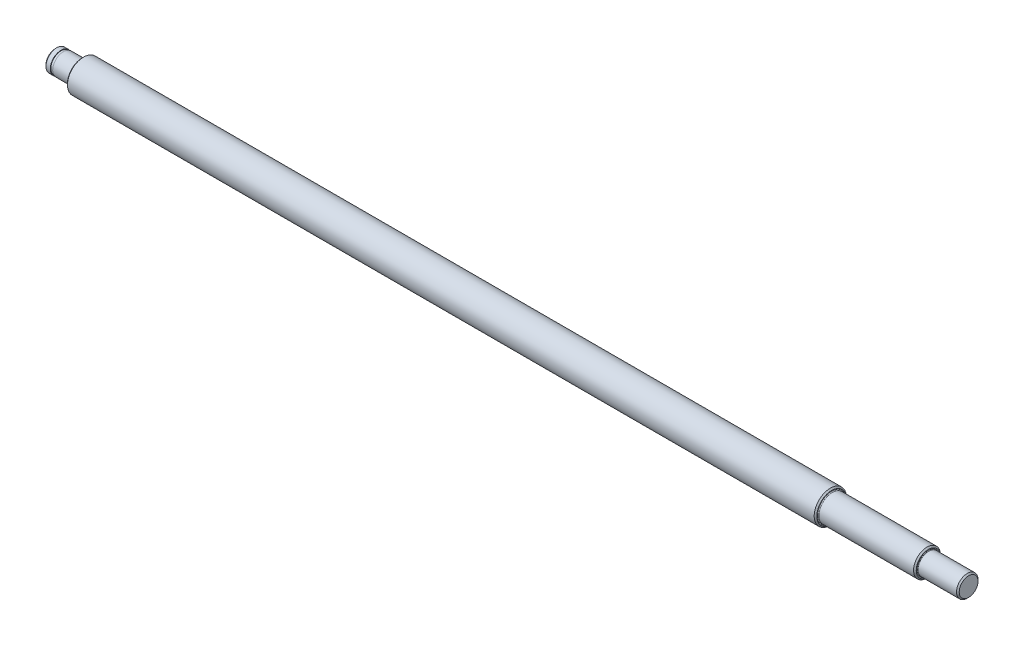
ISO-10303-21;
HEADER;
FILE_DESCRIPTION(('STEP AP214'),'2;1');
FILE_NAME('part.step','',(''),(''),'','','');
FILE_SCHEMA(('AUTOMOTIVE_DESIGN { 1 0 10303 214 1 1 1 1 }'));
ENDSEC;
DATA;
#1=APPLICATION_CONTEXT('core data for automotive mechanical design processes');
#2=APPLICATION_PROTOCOL_DEFINITION('international standard','automotive_design',2000,#1);
#3=PRODUCT_CONTEXT('',#1,'mechanical');
#4=PRODUCT('Part','Part','',(#3));
#5=PRODUCT_RELATED_PRODUCT_CATEGORY('part','',(#4));
#6=PRODUCT_DEFINITION_FORMATION('','',#4);
#7=PRODUCT_DEFINITION_CONTEXT('part definition',#1,'design');
#8=PRODUCT_DEFINITION('design','',#6,#7);
#9=PRODUCT_DEFINITION_SHAPE('','',#8);
#10=(LENGTH_UNIT() NAMED_UNIT(*) SI_UNIT(.MILLI.,.METRE.));
#11=(NAMED_UNIT(*) PLANE_ANGLE_UNIT() SI_UNIT($,.RADIAN.));
#12=(NAMED_UNIT(*) SI_UNIT($,.STERADIAN.) SOLID_ANGLE_UNIT());
#13=UNCERTAINTY_MEASURE_WITH_UNIT(LENGTH_MEASURE(1.E-05),#10,'distance_accuracy_value','');
#14=(GEOMETRIC_REPRESENTATION_CONTEXT(3) GLOBAL_UNCERTAINTY_ASSIGNED_CONTEXT((#13)) GLOBAL_UNIT_ASSIGNED_CONTEXT((#10,
#11,#12)) REPRESENTATION_CONTEXT('',''));
#15=CARTESIAN_POINT('',(0.,0.,0.));
#16=DIRECTION('',(0.,0.,1.));
#17=DIRECTION('',(1.,0.,0.));
#18=AXIS2_PLACEMENT_3D('',#15,#16,#17);
#19=CARTESIAN_POINT('',(0.500000000000004,0.,0.));
#20=DIRECTION('',(1.,0.,0.));
#21=DIRECTION('',(0.,0.,-1.));
#22=AXIS2_PLACEMENT_3D('',#19,#20,#21);
#23=CONICAL_SURFACE('',#22,4.,0.785398163397416);
#24=CARTESIAN_POINT('',(0.,0.,0.));
#25=DIRECTION('',(-1.,0.,0.));
#26=DIRECTION('',(0.,0.,1.));
#27=AXIS2_PLACEMENT_3D('',#24,#25,#26);
#28=CIRCLE('',#27,3.50000000000003);
#29=CARTESIAN_POINT('',(0.,0.,3.50000000000003));
#30=VERTEX_POINT('',#29);
#31=EDGE_CURVE('E104',#30,#30,#28,.T.);
#32=ORIENTED_EDGE('',*,*,#31,.F.);
#33=EDGE_LOOP('',(#32));
#34=FACE_BOUND('',#33,.T.);
#35=CARTESIAN_POINT('',(0.500000000000004,0.,0.));
#36=DIRECTION('',(-1.,0.,0.));
#37=DIRECTION('',(0.,0.,1.));
#38=AXIS2_PLACEMENT_3D('',#35,#36,#37);
#39=CIRCLE('',#38,4.);
#40=CARTESIAN_POINT('',(0.500000000000004,0.,4.));
#41=VERTEX_POINT('',#40);
#42=EDGE_CURVE('E10',#41,#41,#39,.T.);
#43=ORIENTED_EDGE('',*,*,#42,.T.);
#44=EDGE_LOOP('',(#43));
#45=FACE_BOUND('',#44,.T.);
#46=ADVANCED_FACE('F40',(#34,#45),#23,.T.);
#47=CARTESIAN_POINT('',(-20.,0.,0.));
#48=DIRECTION('',(-1.,0.,0.));
#49=DIRECTION('',(0.,0.,1.));
#50=AXIS2_PLACEMENT_3D('',#47,#48,#49);
#51=CYLINDRICAL_SURFACE('',#50,4.);
#52=ORIENTED_EDGE('',*,*,#42,.F.);
#53=EDGE_LOOP('',(#52));
#54=FACE_BOUND('',#53,.T.);
#55=CARTESIAN_POINT('',(2.10000000000001,0.,0.));
#56=DIRECTION('',(-1.,0.,0.));
#57=DIRECTION('',(0.,0.,1.));
#58=AXIS2_PLACEMENT_3D('',#55,#56,#57);
#59=CIRCLE('',#58,4.);
#60=CARTESIAN_POINT('',(2.10000000000001,0.,4.));
#61=VERTEX_POINT('',#60);
#62=EDGE_CURVE('E46',#61,#61,#59,.T.);
#63=ORIENTED_EDGE('',*,*,#62,.T.);
#64=EDGE_LOOP('',(#63));
#65=FACE_BOUND('',#64,.T.);
#66=ADVANCED_FACE('F111',(#54,#65),#51,.T.);
#67=CARTESIAN_POINT('',(2.10000000000001,4.,0.));
#68=DIRECTION('',(-1.,0.,0.));
#69=DIRECTION('',(0.,0.,1.));
#70=AXIS2_PLACEMENT_3D('',#67,#68,#69);
#71=PLANE('',#70);
#72=ORIENTED_EDGE('',*,*,#62,.F.);
#73=EDGE_LOOP('',(#72));
#74=FACE_BOUND('',#73,.T.);
#75=CARTESIAN_POINT('',(2.10000000000001,0.,0.));
#76=DIRECTION('',(-1.,0.,0.));
#77=DIRECTION('',(0.,0.,1.));
#78=AXIS2_PLACEMENT_3D('',#75,#76,#77);
#79=CIRCLE('',#78,3.8);
#80=CARTESIAN_POINT('',(2.10000000000001,0.,3.8));
#81=VERTEX_POINT('',#80);
#82=EDGE_CURVE('E50',#81,#81,#79,.T.);
#83=ORIENTED_EDGE('',*,*,#82,.T.);
#84=EDGE_LOOP('',(#83));
#85=FACE_BOUND('',#84,.T.);
#86=ADVANCED_FACE('F115',(#74,#85),#71,.F.);
#87=CARTESIAN_POINT('',(-20.,0.,0.));
#88=DIRECTION('',(-1.,0.,0.));
#89=DIRECTION('',(0.,0.,1.));
#90=AXIS2_PLACEMENT_3D('',#87,#88,#89);
#91=CYLINDRICAL_SURFACE('',#90,3.8);
#92=ORIENTED_EDGE('',*,*,#82,.F.);
#93=EDGE_LOOP('',(#92));
#94=FACE_BOUND('',#93,.T.);
#95=CARTESIAN_POINT('',(3.00000000000001,0.,0.));
#96=DIRECTION('',(-1.,0.,0.));
#97=DIRECTION('',(0.,0.,1.));
#98=AXIS2_PLACEMENT_3D('',#95,#96,#97);
#99=CIRCLE('',#98,3.8);
#100=CARTESIAN_POINT('',(3.00000000000001,0.,3.8));
#101=VERTEX_POINT('',#100);
#102=EDGE_CURVE('E54',#101,#101,#99,.T.);
#103=ORIENTED_EDGE('',*,*,#102,.T.);
#104=EDGE_LOOP('',(#103));
#105=FACE_BOUND('',#104,.T.);
#106=ADVANCED_FACE('F120',(#94,#105),#91,.T.);
#107=CARTESIAN_POINT('',(3.00000000000001,4.,0.));
#108=DIRECTION('',(1.,0.,0.));
#109=DIRECTION('',(0.,0.,-1.));
#110=AXIS2_PLACEMENT_3D('',#107,#108,#109);
#111=PLANE('',#110);
#112=ORIENTED_EDGE('',*,*,#102,.F.);
#113=EDGE_LOOP('',(#112));
#114=FACE_BOUND('',#113,.T.);
#115=CARTESIAN_POINT('',(3.00000000000001,0.,0.));
#116=DIRECTION('',(-1.,0.,0.));
#117=DIRECTION('',(0.,0.,1.));
#118=AXIS2_PLACEMENT_3D('',#115,#116,#117);
#119=CIRCLE('',#118,4.);
#120=CARTESIAN_POINT('',(3.00000000000001,0.,4.));
#121=VERTEX_POINT('',#120);
#122=EDGE_CURVE('E59',#121,#121,#119,.T.);
#123=ORIENTED_EDGE('',*,*,#122,.T.);
#124=EDGE_LOOP('',(#123));
#125=FACE_BOUND('',#124,.T.);
#126=ADVANCED_FACE('F126',(#114,#125),#111,.F.);
#127=CARTESIAN_POINT('',(-20.,0.,0.));
#128=DIRECTION('',(-1.,0.,0.));
#129=DIRECTION('',(0.,0.,1.));
#130=AXIS2_PLACEMENT_3D('',#127,#128,#129);
#131=CYLINDRICAL_SURFACE('',#130,4.);
#132=ORIENTED_EDGE('',*,*,#122,.F.);
#133=EDGE_LOOP('',(#132));
#134=FACE_BOUND('',#133,.T.);
#135=CARTESIAN_POINT('',(9.70000000000001,0.,0.));
#136=DIRECTION('',(-1.,0.,0.));
#137=DIRECTION('',(0.,0.,1.));
#138=AXIS2_PLACEMENT_3D('',#135,#136,#137);
#139=CIRCLE('',#138,4.);
#140=CARTESIAN_POINT('',(9.70000000000001,0.,4.));
#141=VERTEX_POINT('',#140);
#142=EDGE_CURVE('E62',#141,#141,#139,.T.);
#143=ORIENTED_EDGE('',*,*,#142,.T.);
#144=EDGE_LOOP('',(#143));
#145=FACE_BOUND('',#144,.T.);
#146=ADVANCED_FACE('F130',(#134,#145),#131,.T.);
#147=CARTESIAN_POINT('',(9.70000000000001,0.,0.));
#148=DIRECTION('',(-1.,0.,0.));
#149=DIRECTION('',(0.,0.,1.));
#150=AXIS2_PLACEMENT_3D('',#147,#148,#149);
#151=TOROIDAL_SURFACE('',#150,4.3,0.3);
#152=ORIENTED_EDGE('',*,*,#142,.F.);
#153=EDGE_LOOP('',(#152));
#154=FACE_BOUND('',#153,.T.);
#155=CARTESIAN_POINT('',(10.,0.,0.));
#156=DIRECTION('',(-1.,0.,0.));
#157=DIRECTION('',(0.,0.,1.));
#158=AXIS2_PLACEMENT_3D('',#155,#156,#157);
#159=CIRCLE('',#158,4.3);
#160=CARTESIAN_POINT('',(10.,0.,4.3));
#161=VERTEX_POINT('',#160);
#162=EDGE_CURVE('E65',#161,#161,#159,.T.);
#163=ORIENTED_EDGE('',*,*,#162,.T.);
#164=EDGE_LOOP('',(#163));
#165=FACE_BOUND('',#164,.T.);
#166=ADVANCED_FACE('F134',(#154,#165),#151,.F.);
#167=CARTESIAN_POINT('',(10.,5.50000000000002,0.));
#168=DIRECTION('',(1.,0.,0.));
#169=DIRECTION('',(0.,0.,-1.));
#170=AXIS2_PLACEMENT_3D('',#167,#168,#169);
#171=PLANE('',#170);
#172=ORIENTED_EDGE('',*,*,#162,.F.);
#173=EDGE_LOOP('',(#172));
#174=FACE_BOUND('',#173,.T.);
#175=CARTESIAN_POINT('',(10.,0.,0.));
#176=DIRECTION('',(-1.,0.,0.));
#177=DIRECTION('',(0.,0.,1.));
#178=AXIS2_PLACEMENT_3D('',#175,#176,#177);
#179=CIRCLE('',#178,5.50000000000002);
#180=CARTESIAN_POINT('',(10.,0.,5.50000000000002));
#181=VERTEX_POINT('',#180);
#182=EDGE_CURVE('E68',#181,#181,#179,.T.);
#183=ORIENTED_EDGE('',*,*,#182,.T.);
#184=EDGE_LOOP('',(#183));
#185=FACE_BOUND('',#184,.T.);
#186=ADVANCED_FACE('F138',(#174,#185),#171,.F.);
#187=CARTESIAN_POINT('',(10.5,0.,0.));
#188=DIRECTION('',(1.,0.,0.));
#189=DIRECTION('',(0.,0.,-1.));
#190=AXIS2_PLACEMENT_3D('',#187,#188,#189);
#191=CONICAL_SURFACE('',#190,5.99999999999999,0.785398163397423);
#192=ORIENTED_EDGE('',*,*,#182,.F.);
#193=EDGE_LOOP('',(#192));
#194=FACE_BOUND('',#193,.T.);
#195=CARTESIAN_POINT('',(10.5,0.,0.));
#196=DIRECTION('',(-1.,0.,0.));
#197=DIRECTION('',(0.,0.,1.));
#198=AXIS2_PLACEMENT_3D('',#195,#196,#197);
#199=CIRCLE('',#198,5.99999999999999);
#200=CARTESIAN_POINT('',(10.5,0.,5.99999999999999));
#201=VERTEX_POINT('',#200);
#202=EDGE_CURVE('E71',#201,#201,#199,.T.);
#203=ORIENTED_EDGE('',*,*,#202,.T.);
#204=EDGE_LOOP('',(#203));
#205=FACE_BOUND('',#204,.T.);
#206=ADVANCED_FACE('F142',(#194,#205),#191,.T.);
#207=CARTESIAN_POINT('',(-20.,0.,0.));
#208=DIRECTION('',(-1.,0.,0.));
#209=DIRECTION('',(0.,0.,1.));
#210=AXIS2_PLACEMENT_3D('',#207,#208,#209);
#211=CYLINDRICAL_SURFACE('',#210,6.00000000000002);
#212=ORIENTED_EDGE('',*,*,#202,.F.);
#213=EDGE_LOOP('',(#212));
#214=FACE_BOUND('',#213,.T.);
#215=CARTESIAN_POINT('',(288.5,0.,0.));
#216=DIRECTION('',(-1.,0.,0.));
#217=DIRECTION('',(0.,0.,1.));
#218=AXIS2_PLACEMENT_3D('',#215,#216,#217);
#219=CIRCLE('',#218,6.00000000000005);
#220=CARTESIAN_POINT('',(288.5,0.,6.00000000000005));
#221=VERTEX_POINT('',#220);
#222=EDGE_CURVE('E74',#221,#221,#219,.T.);
#223=ORIENTED_EDGE('',*,*,#222,.T.);
#224=EDGE_LOOP('',(#223));
#225=FACE_BOUND('',#224,.T.);
#226=ADVANCED_FACE('F146',(#214,#225),#211,.T.);
#227=CARTESIAN_POINT('',(289.,0.,0.));
#228=DIRECTION('',(-1.,0.,0.));
#229=DIRECTION('',(0.,0.,1.));
#230=AXIS2_PLACEMENT_3D('',#227,#228,#229);
#231=CONICAL_SURFACE('',#230,5.50000000000002,0.78539816339748);
#232=ORIENTED_EDGE('',*,*,#222,.F.);
#233=EDGE_LOOP('',(#232));
#234=FACE_BOUND('',#233,.T.);
#235=CARTESIAN_POINT('',(289.,0.,0.));
#236=DIRECTION('',(-1.,0.,0.));
#237=DIRECTION('',(0.,0.,1.));
#238=AXIS2_PLACEMENT_3D('',#235,#236,#237);
#239=CIRCLE('',#238,5.50000000000002);
#240=CARTESIAN_POINT('',(289.,0.,5.50000000000002));
#241=VERTEX_POINT('',#240);
#242=EDGE_CURVE('E77',#241,#241,#239,.T.);
#243=ORIENTED_EDGE('',*,*,#242,.T.);
#244=EDGE_LOOP('',(#243));
#245=FACE_BOUND('',#244,.T.);
#246=ADVANCED_FACE('F150',(#234,#245),#231,.T.);
#247=CARTESIAN_POINT('',(289.,5.30000000000004,0.));
#248=DIRECTION('',(-1.,0.,0.));
#249=DIRECTION('',(0.,0.,1.));
#250=AXIS2_PLACEMENT_3D('',#247,#248,#249);
#251=PLANE('',#250);
#252=ORIENTED_EDGE('',*,*,#242,.F.);
#253=EDGE_LOOP('',(#252));
#254=FACE_BOUND('',#253,.T.);
#255=CARTESIAN_POINT('',(289.,0.,0.));
#256=DIRECTION('',(-1.,0.,0.));
#257=DIRECTION('',(0.,0.,1.));
#258=AXIS2_PLACEMENT_3D('',#255,#256,#257);
#259=CIRCLE('',#258,5.30000000000004);
#260=CARTESIAN_POINT('',(289.,0.,5.30000000000004));
#261=VERTEX_POINT('',#260);
#262=EDGE_CURVE('E80',#261,#261,#259,.T.);
#263=ORIENTED_EDGE('',*,*,#262,.T.);
#264=EDGE_LOOP('',(#263));
#265=FACE_BOUND('',#264,.T.);
#266=ADVANCED_FACE('F154',(#254,#265),#251,.F.);
#267=CARTESIAN_POINT('',(289.3,0.,0.));
#268=DIRECTION('',(-1.,0.,0.));
#269=DIRECTION('',(0.,0.,1.));
#270=AXIS2_PLACEMENT_3D('',#267,#268,#269);
#271=TOROIDAL_SURFACE('',#270,5.30000000000004,0.300000000000011);
#272=ORIENTED_EDGE('',*,*,#262,.F.);
#273=EDGE_LOOP('',(#272));
#274=FACE_BOUND('',#273,.T.);
#275=CARTESIAN_POINT('',(289.3,0.,0.));
#276=DIRECTION('',(-1.,0.,0.));
#277=DIRECTION('',(0.,0.,1.));
#278=AXIS2_PLACEMENT_3D('',#275,#276,#277);
#279=CIRCLE('',#278,5.00000000000004);
#280=CARTESIAN_POINT('',(289.3,0.,5.00000000000004));
#281=VERTEX_POINT('',#280);
#282=EDGE_CURVE('E83',#281,#281,#279,.T.);
#283=ORIENTED_EDGE('',*,*,#282,.T.);
#284=EDGE_LOOP('',(#283));
#285=FACE_BOUND('',#284,.T.);
#286=ADVANCED_FACE('F158',(#274,#285),#271,.F.);
#287=CARTESIAN_POINT('',(-20.,0.,0.));
#288=DIRECTION('',(-1.,0.,0.));
#289=DIRECTION('',(0.,0.,1.));
#290=AXIS2_PLACEMENT_3D('',#287,#288,#289);
#291=CYLINDRICAL_SURFACE('',#290,5.00000000000007);
#292=ORIENTED_EDGE('',*,*,#282,.F.);
#293=EDGE_LOOP('',(#292));
#294=FACE_BOUND('',#293,.T.);
#295=CARTESIAN_POINT('',(324.5,0.,0.));
#296=DIRECTION('',(-1.,0.,0.));
#297=DIRECTION('',(0.,0.,1.));
#298=AXIS2_PLACEMENT_3D('',#295,#296,#297);
#299=CIRCLE('',#298,5.0000000000001);
#300=CARTESIAN_POINT('',(324.5,0.,5.0000000000001));
#301=VERTEX_POINT('',#300);
#302=EDGE_CURVE('E86',#301,#301,#299,.T.);
#303=ORIENTED_EDGE('',*,*,#302,.T.);
#304=EDGE_LOOP('',(#303));
#305=FACE_BOUND('',#304,.T.);
#306=ADVANCED_FACE('F162',(#294,#305),#291,.T.);
#307=CARTESIAN_POINT('',(325.,0.,0.));
#308=DIRECTION('',(-1.,0.,0.));
#309=DIRECTION('',(0.,0.,1.));
#310=AXIS2_PLACEMENT_3D('',#307,#308,#309);
#311=CONICAL_SURFACE('',#310,4.50000000000007,0.785398163397474);
#312=ORIENTED_EDGE('',*,*,#302,.F.);
#313=EDGE_LOOP('',(#312));
#314=FACE_BOUND('',#313,.T.);
#315=CARTESIAN_POINT('',(325.,0.,0.));
#316=DIRECTION('',(-1.,0.,0.));
#317=DIRECTION('',(0.,0.,1.));
#318=AXIS2_PLACEMENT_3D('',#315,#316,#317);
#319=CIRCLE('',#318,4.50000000000007);
#320=CARTESIAN_POINT('',(325.,0.,4.50000000000007));
#321=VERTEX_POINT('',#320);
#322=EDGE_CURVE('E89',#321,#321,#319,.T.);
#323=ORIENTED_EDGE('',*,*,#322,.T.);
#324=EDGE_LOOP('',(#323));
#325=FACE_BOUND('',#324,.T.);
#326=ADVANCED_FACE('F166',(#314,#325),#311,.T.);
#327=CARTESIAN_POINT('',(325.,4.20000000000006,0.));
#328=DIRECTION('',(-1.,0.,0.));
#329=DIRECTION('',(0.,0.,1.));
#330=AXIS2_PLACEMENT_3D('',#327,#328,#329);
#331=PLANE('',#330);
#332=ORIENTED_EDGE('',*,*,#322,.F.);
#333=EDGE_LOOP('',(#332));
#334=FACE_BOUND('',#333,.T.);
#335=CARTESIAN_POINT('',(325.,0.,0.));
#336=DIRECTION('',(-1.,0.,0.));
#337=DIRECTION('',(0.,0.,1.));
#338=AXIS2_PLACEMENT_3D('',#335,#336,#337);
#339=CIRCLE('',#338,4.20000000000006);
#340=CARTESIAN_POINT('',(325.,0.,4.20000000000006));
#341=VERTEX_POINT('',#340);
#342=EDGE_CURVE('E92',#341,#341,#339,.T.);
#343=ORIENTED_EDGE('',*,*,#342,.T.);
#344=EDGE_LOOP('',(#343));
#345=FACE_BOUND('',#344,.T.);
#346=ADVANCED_FACE('F170',(#334,#345),#331,.F.);
#347=CARTESIAN_POINT('',(325.2,0.,0.));
#348=DIRECTION('',(-1.,0.,0.));
#349=DIRECTION('',(0.,0.,1.));
#350=AXIS2_PLACEMENT_3D('',#347,#348,#349);
#351=TOROIDAL_SURFACE('',#350,4.20000000000006,0.199999999999989);
#352=ORIENTED_EDGE('',*,*,#342,.F.);
#353=EDGE_LOOP('',(#352));
#354=FACE_BOUND('',#353,.T.);
#355=CARTESIAN_POINT('',(325.2,0.,0.));
#356=DIRECTION('',(-1.,0.,0.));
#357=DIRECTION('',(0.,0.,1.));
#358=AXIS2_PLACEMENT_3D('',#355,#356,#357);
#359=CIRCLE('',#358,4.00000000000006);
#360=CARTESIAN_POINT('',(325.2,0.,4.00000000000006));
#361=VERTEX_POINT('',#360);
#362=EDGE_CURVE('E95',#361,#361,#359,.T.);
#363=ORIENTED_EDGE('',*,*,#362,.T.);
#364=EDGE_LOOP('',(#363));
#365=FACE_BOUND('',#364,.T.);
#366=ADVANCED_FACE('F174',(#354,#365),#351,.F.);
#367=CARTESIAN_POINT('',(-20.,0.,0.));
#368=DIRECTION('',(-1.,0.,0.));
#369=DIRECTION('',(0.,0.,1.));
#370=AXIS2_PLACEMENT_3D('',#367,#368,#369);
#371=CYLINDRICAL_SURFACE('',#370,4.00000000000006);
#372=ORIENTED_EDGE('',*,*,#362,.F.);
#373=EDGE_LOOP('',(#372));
#374=FACE_BOUND('',#373,.T.);
#375=CARTESIAN_POINT('',(339.5,0.,0.));
#376=DIRECTION('',(-1.,0.,0.));
#377=DIRECTION('',(0.,0.,1.));
#378=AXIS2_PLACEMENT_3D('',#375,#376,#377);
#379=CIRCLE('',#378,4.00000000000006);
#380=CARTESIAN_POINT('',(339.5,0.,4.00000000000006));
#381=VERTEX_POINT('',#380);
#382=EDGE_CURVE('E98',#381,#381,#379,.T.);
#383=ORIENTED_EDGE('',*,*,#382,.T.);
#384=EDGE_LOOP('',(#383));
#385=FACE_BOUND('',#384,.T.);
#386=ADVANCED_FACE('F178',(#374,#385),#371,.T.);
#387=CARTESIAN_POINT('',(340.,0.,0.));
#388=DIRECTION('',(-1.,0.,0.));
#389=DIRECTION('',(0.,0.,1.));
#390=AXIS2_PLACEMENT_3D('',#387,#388,#389);
#391=CONICAL_SURFACE('',#390,3.50000000000003,0.78539816339748);
#392=ORIENTED_EDGE('',*,*,#382,.F.);
#393=EDGE_LOOP('',(#392));
#394=FACE_BOUND('',#393,.T.);
#395=CARTESIAN_POINT('',(340.,0.,0.));
#396=DIRECTION('',(-1.,0.,0.));
#397=DIRECTION('',(0.,0.,1.));
#398=AXIS2_PLACEMENT_3D('',#395,#396,#397);
#399=CIRCLE('',#398,3.50000000000003);
#400=CARTESIAN_POINT('',(340.,0.,3.50000000000003));
#401=VERTEX_POINT('',#400);
#402=EDGE_CURVE('E101',#401,#401,#399,.T.);
#403=ORIENTED_EDGE('',*,*,#402,.T.);
#404=EDGE_LOOP('',(#403));
#405=FACE_BOUND('',#404,.T.);
#406=ADVANCED_FACE('F182',(#394,#405),#391,.T.);
#407=CARTESIAN_POINT('',(340.,0.,0.));
#408=DIRECTION('',(-1.,0.,0.));
#409=DIRECTION('',(0.,0.,1.));
#410=AXIS2_PLACEMENT_3D('',#407,#408,#409);
#411=PLANE('',#410);
#412=ORIENTED_EDGE('',*,*,#402,.F.);
#413=EDGE_LOOP('',(#412));
#414=FACE_BOUND('',#413,.T.);
#415=ADVANCED_FACE('F186',(#414),#411,.F.);
#416=CARTESIAN_POINT('',(0.,3.50000000000003,0.));
#417=DIRECTION('',(1.,0.,0.));
#418=DIRECTION('',(0.,0.,-1.));
#419=AXIS2_PLACEMENT_3D('',#416,#417,#418);
#420=PLANE('',#419);
#421=ORIENTED_EDGE('',*,*,#31,.T.);
#422=EDGE_LOOP('',(#421));
#423=FACE_BOUND('',#422,.T.);
#424=ADVANCED_FACE('F108',(#423),#420,.F.);
#425=CLOSED_SHELL('',(#46,#66,#86,#106,#126,#146,#166,#186,#206,#226,#246,#266,#286,#306,#326,
#346,#366,#386,#406,#415,#424));
#426=MANIFOLD_SOLID_BREP('B2',#425);
#427=ADVANCED_BREP_SHAPE_REPRESENTATION('',(#18,#426),#14);
#428=SHAPE_DEFINITION_REPRESENTATION(#9,#427);
ENDSEC;
END-ISO-10303-21;
